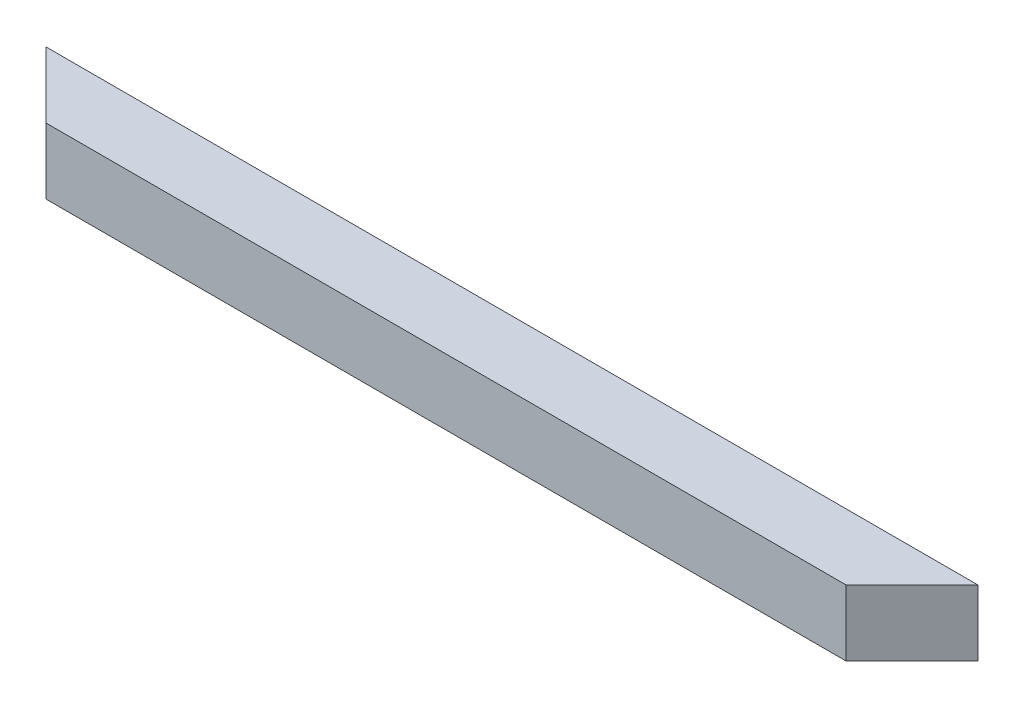
ISO-10303-21;
HEADER;
FILE_DESCRIPTION(('STEP AP214'),'2;1');
FILE_NAME('part.step','',(''),(''),'','','');
FILE_SCHEMA(('AUTOMOTIVE_DESIGN { 1 0 10303 214 1 1 1 1 }'));
ENDSEC;
DATA;
#1=APPLICATION_CONTEXT('core data for automotive mechanical design processes');
#2=APPLICATION_PROTOCOL_DEFINITION('international standard','automotive_design',2000,#1);
#3=PRODUCT_CONTEXT('',#1,'mechanical');
#4=PRODUCT('Part','Part','',(#3));
#5=PRODUCT_RELATED_PRODUCT_CATEGORY('part','',(#4));
#6=PRODUCT_DEFINITION_FORMATION('','',#4);
#7=PRODUCT_DEFINITION_CONTEXT('part definition',#1,'design');
#8=PRODUCT_DEFINITION('design','',#6,#7);
#9=PRODUCT_DEFINITION_SHAPE('','',#8);
#10=(LENGTH_UNIT() NAMED_UNIT(*) SI_UNIT(.MILLI.,.METRE.));
#11=(NAMED_UNIT(*) PLANE_ANGLE_UNIT() SI_UNIT($,.RADIAN.));
#12=(NAMED_UNIT(*) SI_UNIT($,.STERADIAN.) SOLID_ANGLE_UNIT());
#13=UNCERTAINTY_MEASURE_WITH_UNIT(LENGTH_MEASURE(1.E-05),#10,'distance_accuracy_value','');
#14=(GEOMETRIC_REPRESENTATION_CONTEXT(3) GLOBAL_UNCERTAINTY_ASSIGNED_CONTEXT((#13)) GLOBAL_UNIT_ASSIGNED_CONTEXT((#10,
#11,#12)) REPRESENTATION_CONTEXT('',''));
#15=CARTESIAN_POINT('',(0.,0.,0.));
#16=DIRECTION('',(0.,0.,1.));
#17=DIRECTION('',(1.,0.,0.));
#18=AXIS2_PLACEMENT_3D('',#15,#16,#17);
#19=CARTESIAN_POINT('',(-179.605051,25.4,-12.7));
#20=DIRECTION('',(0.,0.,1.));
#21=DIRECTION('',(1.,0.,0.));
#22=AXIS2_PLACEMENT_3D('',#19,#20,#21);
#23=PLANE('',#22);
#24=DIRECTION('',(-1.,0.,0.));
#25=VECTOR('',#24,1.);
#26=CARTESIAN_POINT('',(-179.605051,0.,-12.7));
#27=LINE('',#26,#25);
#28=CARTESIAN_POINT('',(179.605051,0.,-12.7));
#29=VERTEX_POINT('',#28);
#30=CARTESIAN_POINT('',(-179.605051,0.,-12.7));
#31=VERTEX_POINT('',#30);
#32=EDGE_CURVE('E96',#29,#31,#27,.T.);
#33=ORIENTED_EDGE('',*,*,#32,.T.);
#34=DIRECTION('',(0.,-1.,0.));
#35=VECTOR('',#34,1.);
#36=CARTESIAN_POINT('',(-179.605051,25.4,-12.7));
#37=LINE('',#36,#35);
#38=CARTESIAN_POINT('',(-179.605051,25.4,-12.7));
#39=VERTEX_POINT('',#38);
#40=EDGE_CURVE('E11',#39,#31,#37,.T.);
#41=ORIENTED_EDGE('',*,*,#40,.F.);
#42=DIRECTION('',(-1.,0.,0.));
#43=VECTOR('',#42,1.);
#44=CARTESIAN_POINT('',(-179.605051,25.4,-12.7));
#45=LINE('',#44,#43);
#46=CARTESIAN_POINT('',(179.605051,25.4,-12.7));
#47=VERTEX_POINT('',#46);
#48=EDGE_CURVE('E84',#47,#39,#45,.T.);
#49=ORIENTED_EDGE('',*,*,#48,.F.);
#50=DIRECTION('',(0.,-1.,0.));
#51=VECTOR('',#50,1.);
#52=CARTESIAN_POINT('',(179.605051,25.4,-12.7));
#53=LINE('',#52,#51);
#54=EDGE_CURVE('E92',#47,#29,#53,.T.);
#55=ORIENTED_EDGE('',*,*,#54,.T.);
#56=EDGE_LOOP('',(#33,#41,#49,#55));
#57=FACE_BOUND('',#56,.T.);
#58=ADVANCED_FACE('F33',(#57),#23,.F.);
#59=CARTESIAN_POINT('',(-179.605051,25.4,-12.7));
#60=DIRECTION('',(0.707106781186547,0.,-0.707106781186548));
#61=DIRECTION('',(-0.707106781186548,0.,-0.707106781186547));
#62=AXIS2_PLACEMENT_3D('',#59,#60,#61);
#63=PLANE('',#62);
#64=DIRECTION('',(0.707106781186548,0.,0.707106781186547));
#65=VECTOR('',#64,1.);
#66=CARTESIAN_POINT('',(-179.605051,0.,-12.7));
#67=LINE('',#66,#65);
#68=CARTESIAN_POINT('',(-154.205051,0.,12.7));
#69=VERTEX_POINT('',#68);
#70=EDGE_CURVE('E88',#31,#69,#67,.T.);
#71=ORIENTED_EDGE('',*,*,#70,.T.);
#72=DIRECTION('',(0.,-1.,0.));
#73=VECTOR('',#72,1.);
#74=CARTESIAN_POINT('',(-154.205051,25.4,12.7));
#75=LINE('',#74,#73);
#76=CARTESIAN_POINT('',(-154.205051,25.4,12.7));
#77=VERTEX_POINT('',#76);
#78=EDGE_CURVE('E41',#77,#69,#75,.T.);
#79=ORIENTED_EDGE('',*,*,#78,.F.);
#80=DIRECTION('',(0.707106781186548,0.,0.707106781186547));
#81=VECTOR('',#80,1.);
#82=CARTESIAN_POINT('',(-179.605051,25.4,-12.7));
#83=LINE('',#82,#81);
#84=EDGE_CURVE('E79',#39,#77,#83,.T.);
#85=ORIENTED_EDGE('',*,*,#84,.F.);
#86=ORIENTED_EDGE('',*,*,#40,.T.);
#87=EDGE_LOOP('',(#71,#79,#85,#86));
#88=FACE_BOUND('',#87,.T.);
#89=ADVANCED_FACE('F87',(#88),#63,.F.);
#90=CARTESIAN_POINT('',(-154.205051,25.4,12.7));
#91=DIRECTION('',(0.,0.,-1.));
#92=DIRECTION('',(-1.,0.,0.));
#93=AXIS2_PLACEMENT_3D('',#90,#91,#92);
#94=PLANE('',#93);
#95=DIRECTION('',(1.,0.,0.));
#96=VECTOR('',#95,1.);
#97=CARTESIAN_POINT('',(-154.205051,0.,12.7));
#98=LINE('',#97,#96);
#99=CARTESIAN_POINT('',(154.205051,0.,12.7));
#100=VERTEX_POINT('',#99);
#101=EDGE_CURVE('E66',#69,#100,#98,.T.);
#102=ORIENTED_EDGE('',*,*,#101,.T.);
#103=DIRECTION('',(0.,-1.,0.));
#104=VECTOR('',#103,1.);
#105=CARTESIAN_POINT('',(154.205051,25.4,12.7));
#106=LINE('',#105,#104);
#107=CARTESIAN_POINT('',(154.205051,25.4,12.7));
#108=VERTEX_POINT('',#107);
#109=EDGE_CURVE('E89',#108,#100,#106,.T.);
#110=ORIENTED_EDGE('',*,*,#109,.F.);
#111=DIRECTION('',(1.,0.,0.));
#112=VECTOR('',#111,1.);
#113=CARTESIAN_POINT('',(-154.205051,25.4,12.7));
#114=LINE('',#113,#112);
#115=EDGE_CURVE('E82',#77,#108,#114,.T.);
#116=ORIENTED_EDGE('',*,*,#115,.F.);
#117=ORIENTED_EDGE('',*,*,#78,.T.);
#118=EDGE_LOOP('',(#102,#110,#116,#117));
#119=FACE_BOUND('',#118,.T.);
#120=ADVANCED_FACE('F90',(#119),#94,.F.);
#121=CARTESIAN_POINT('',(179.605051,25.4,-12.7));
#122=DIRECTION('',(-0.707106781186547,0.,-0.707106781186548));
#123=DIRECTION('',(-0.707106781186548,0.,0.707106781186547));
#124=AXIS2_PLACEMENT_3D('',#121,#122,#123);
#125=PLANE('',#124);
#126=DIRECTION('',(0.707106781186548,0.,-0.707106781186547));
#127=VECTOR('',#126,1.);
#128=CARTESIAN_POINT('',(179.605051,0.,-12.7));
#129=LINE('',#128,#127);
#130=EDGE_CURVE('E72',#100,#29,#129,.T.);
#131=ORIENTED_EDGE('',*,*,#130,.T.);
#132=ORIENTED_EDGE('',*,*,#54,.F.);
#133=DIRECTION('',(0.707106781186548,0.,-0.707106781186547));
#134=VECTOR('',#133,1.);
#135=CARTESIAN_POINT('',(179.605051,25.4,-12.7));
#136=LINE('',#135,#134);
#137=EDGE_CURVE('E49',#108,#47,#136,.T.);
#138=ORIENTED_EDGE('',*,*,#137,.F.);
#139=ORIENTED_EDGE('',*,*,#109,.T.);
#140=EDGE_LOOP('',(#131,#132,#138,#139));
#141=FACE_BOUND('',#140,.T.);
#142=ADVANCED_FACE('F103',(#141),#125,.F.);
#143=CARTESIAN_POINT('',(0.,25.4,0.));
#144=DIRECTION('',(0.,-1.,0.));
#145=DIRECTION('',(0.,0.,-1.));
#146=AXIS2_PLACEMENT_3D('',#143,#144,#145);
#147=PLANE('',#146);
#148=ORIENTED_EDGE('',*,*,#48,.T.);
#149=ORIENTED_EDGE('',*,*,#84,.T.);
#150=ORIENTED_EDGE('',*,*,#115,.T.);
#151=ORIENTED_EDGE('',*,*,#137,.T.);
#152=EDGE_LOOP('',(#148,#149,#150,#151));
#153=FACE_BOUND('',#152,.T.);
#154=ADVANCED_FACE('F80',(#153),#147,.F.);
#155=CARTESIAN_POINT('',(0.,0.,0.));
#156=DIRECTION('',(0.,-1.,0.));
#157=DIRECTION('',(0.,0.,-1.));
#158=AXIS2_PLACEMENT_3D('',#155,#156,#157);
#159=PLANE('',#158);
#160=ORIENTED_EDGE('',*,*,#32,.F.);
#161=ORIENTED_EDGE('',*,*,#130,.F.);
#162=ORIENTED_EDGE('',*,*,#101,.F.);
#163=ORIENTED_EDGE('',*,*,#70,.F.);
#164=EDGE_LOOP('',(#160,#161,#162,#163));
#165=FACE_BOUND('',#164,.T.);
#166=ADVANCED_FACE('F106',(#165),#159,.T.);
#167=CLOSED_SHELL('',(#58,#89,#120,#142,#154,#166));
#168=MANIFOLD_SOLID_BREP('B2',#167);
#169=ADVANCED_BREP_SHAPE_REPRESENTATION('',(#18,#168),#14);
#170=SHAPE_DEFINITION_REPRESENTATION(#9,#169);
ENDSEC;
END-ISO-10303-21;
